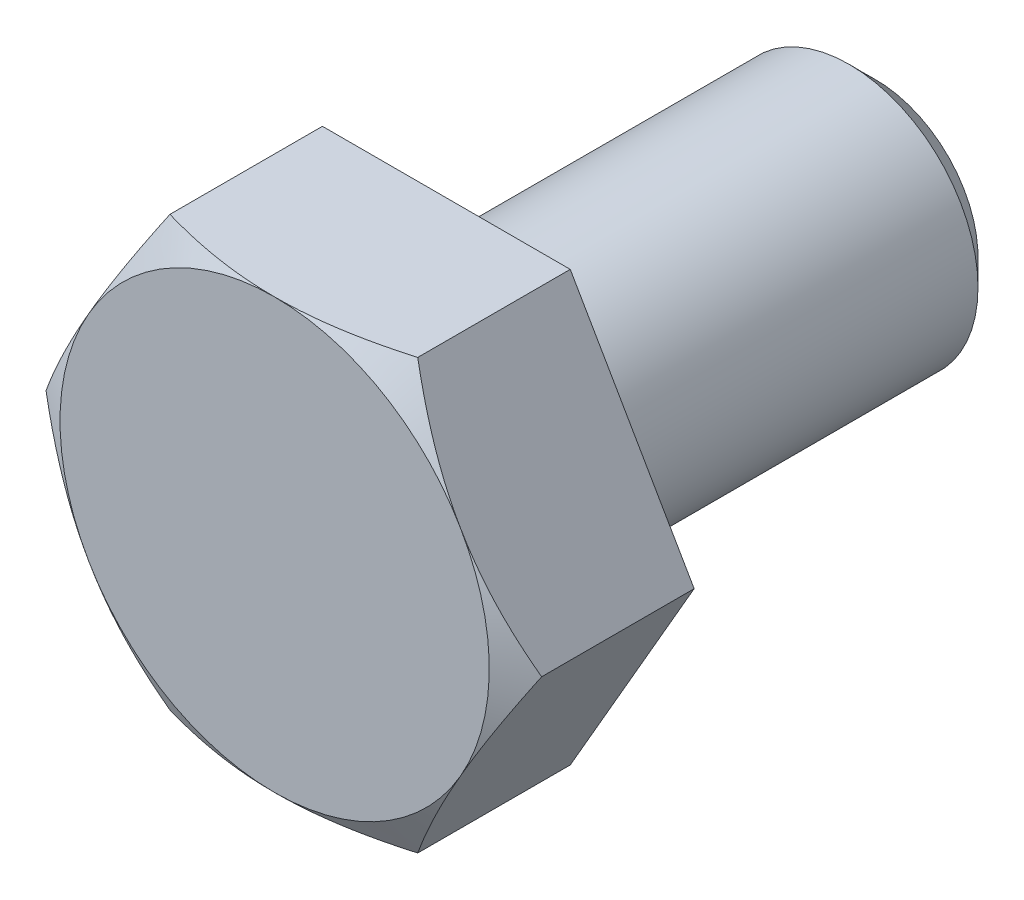
ISO-10303-21;
HEADER;
FILE_DESCRIPTION(('STEP AP214'),'2;1');
FILE_NAME('part.step','',(''),(''),'','','');
FILE_SCHEMA(('AUTOMOTIVE_DESIGN { 1 0 10303 214 1 1 1 1 }'));
ENDSEC;
DATA;
#1=APPLICATION_CONTEXT('core data for automotive mechanical design processes');
#2=APPLICATION_PROTOCOL_DEFINITION('international standard','automotive_design',2000,#1);
#3=PRODUCT_CONTEXT('',#1,'mechanical');
#4=PRODUCT('Part','Part','',(#3));
#5=PRODUCT_RELATED_PRODUCT_CATEGORY('part','',(#4));
#6=PRODUCT_DEFINITION_FORMATION('','',#4);
#7=PRODUCT_DEFINITION_CONTEXT('part definition',#1,'design');
#8=PRODUCT_DEFINITION('design','',#6,#7);
#9=PRODUCT_DEFINITION_SHAPE('','',#8);
#10=(LENGTH_UNIT() NAMED_UNIT(*) SI_UNIT(.MILLI.,.METRE.));
#11=(NAMED_UNIT(*) PLANE_ANGLE_UNIT() SI_UNIT($,.RADIAN.));
#12=(NAMED_UNIT(*) SI_UNIT($,.STERADIAN.) SOLID_ANGLE_UNIT());
#13=UNCERTAINTY_MEASURE_WITH_UNIT(LENGTH_MEASURE(1.E-05),#10,'distance_accuracy_value','');
#14=(GEOMETRIC_REPRESENTATION_CONTEXT(3) GLOBAL_UNCERTAINTY_ASSIGNED_CONTEXT((#13)) GLOBAL_UNIT_ASSIGNED_CONTEXT((#10,
#11,#12)) REPRESENTATION_CONTEXT('',''));
#15=CARTESIAN_POINT('',(0.,0.,0.));
#16=DIRECTION('',(0.,0.,1.));
#17=DIRECTION('',(1.,0.,0.));
#18=AXIS2_PLACEMENT_3D('',#15,#16,#17);
#19=CARTESIAN_POINT('',(-8.66025403784437,-5.,0.));
#20=DIRECTION('',(0.,0.,1.));
#21=DIRECTION('',(1.,0.,0.));
#22=AXIS2_PLACEMENT_3D('',#19,#20,#21);
#23=PLANE('',#22);
#24=CARTESIAN_POINT('',(0.,0.,0.));
#25=DIRECTION('',(0.,0.,1.));
#26=DIRECTION('',(1.,0.,0.));
#27=AXIS2_PLACEMENT_3D('',#24,#25,#26);
#28=CIRCLE('',#27,3.25);
#29=CARTESIAN_POINT('',(3.25,0.,0.));
#30=VERTEX_POINT('',#29);
#31=EDGE_CURVE('E11',#30,#30,#28,.T.);
#32=ORIENTED_EDGE('',*,*,#31,.T.);
#33=EDGE_LOOP('',(#32));
#34=FACE_BOUND('',#33,.T.);
#35=DIRECTION('',(-0.499999999999999,-0.866025403784439,0.));
#36=VECTOR('',#35,1.);
#37=CARTESIAN_POINT('',(-2.88675134594813,5.,0.));
#38=LINE('',#37,#36);
#39=CARTESIAN_POINT('',(-2.88675134594813,5.,0.));
#40=VERTEX_POINT('',#39);
#41=CARTESIAN_POINT('',(-5.77350269189626,0.,0.));
#42=VERTEX_POINT('',#41);
#43=EDGE_CURVE('E123',#40,#42,#38,.T.);
#44=ORIENTED_EDGE('',*,*,#43,.F.);
#45=DIRECTION('',(1.,0.,0.));
#46=VECTOR('',#45,1.);
#47=CARTESIAN_POINT('',(-2.88675134594813,5.,0.));
#48=LINE('',#47,#46);
#49=CARTESIAN_POINT('',(2.88675134594812,5.,0.));
#50=VERTEX_POINT('',#49);
#51=EDGE_CURVE('E255',#40,#50,#48,.T.);
#52=ORIENTED_EDGE('',*,*,#51,.T.);
#53=DIRECTION('',(0.5,-0.866025403784438,0.));
#54=VECTOR('',#53,1.);
#55=CARTESIAN_POINT('',(2.88675134594812,5.,0.));
#56=LINE('',#55,#54);
#57=CARTESIAN_POINT('',(5.77350269189626,0.,0.));
#58=VERTEX_POINT('',#57);
#59=EDGE_CURVE('E258',#50,#58,#56,.T.);
#60=ORIENTED_EDGE('',*,*,#59,.T.);
#61=DIRECTION('',(-0.5,-0.866025403784439,0.));
#62=VECTOR('',#61,1.);
#63=CARTESIAN_POINT('',(5.77350269189626,0.,0.));
#64=LINE('',#63,#62);
#65=CARTESIAN_POINT('',(2.88675134594813,-5.,0.));
#66=VERTEX_POINT('',#65);
#67=EDGE_CURVE('E261',#58,#66,#64,.T.);
#68=ORIENTED_EDGE('',*,*,#67,.T.);
#69=DIRECTION('',(1.,0.,0.));
#70=VECTOR('',#69,1.);
#71=CARTESIAN_POINT('',(-2.88675134594813,-5.,0.));
#72=LINE('',#71,#70);
#73=CARTESIAN_POINT('',(-2.88675134594813,-5.,0.));
#74=VERTEX_POINT('',#73);
#75=EDGE_CURVE('E246',#74,#66,#72,.T.);
#76=ORIENTED_EDGE('',*,*,#75,.F.);
#77=DIRECTION('',(0.5,-0.866025403784439,0.));
#78=VECTOR('',#77,1.);
#79=CARTESIAN_POINT('',(-5.77350269189626,0.,0.));
#80=LINE('',#79,#78);
#81=EDGE_CURVE('E264',#42,#74,#80,.T.);
#82=ORIENTED_EDGE('',*,*,#81,.F.);
#83=EDGE_LOOP('',(#44,#52,#60,#68,#76,#82));
#84=FACE_BOUND('',#83,.T.);
#85=ADVANCED_FACE('F31',(#34,#84),#23,.F.);
#86=CARTESIAN_POINT('',(-2.88675134594813,5.,4.));
#87=DIRECTION('',(0.866025403784439,-0.499999999999999,0.));
#88=DIRECTION('',(0.499999999999999,0.866025403784439,0.));
#89=AXIS2_PLACEMENT_3D('',#86,#87,#88);
#90=PLANE('',#89);
#91=DIRECTION('',(0.,0.,-1.));
#92=VECTOR('',#91,1.);
#93=CARTESIAN_POINT('',(-5.77350269189626,0.,4.));
#94=LINE('',#93,#92);
#95=CARTESIAN_POINT('',(-5.77350269189626,0.,3.5534180126148));
#96=VERTEX_POINT('',#95);
#97=EDGE_CURVE('E116',#96,#42,#94,.T.);
#98=ORIENTED_EDGE('',*,*,#97,.F.);
#99=CARTESIAN_POINT('',(-5.77361816195009,-0.000200000000005782,3.55335134394818));
#100=CARTESIAN_POINT('',(-5.6467543346507,0.219534594525179,3.62661343236237));
#101=CARTESIAN_POINT('',(-5.5188054379059,0.441148584459574,3.69324867808191));
#102=CARTESIAN_POINT('',(-5.26069210252318,0.888213995453507,3.80956100898919));
#103=CARTESIAN_POINT('',(-5.13052307794721,1.11367335959077,3.85919695008421));
#104=CARTESIAN_POINT('',(-4.87177839004641,1.5618323052235,3.9364489745813));
#105=CARTESIAN_POINT('',(-4.74324302208387,1.78446209310419,3.96457962171651));
#106=CARTESIAN_POINT('',(-4.54998783160117,2.11918990184663,3.98980507804631));
#107=CARTESIAN_POINT('',(-4.48552534905128,2.23084219680505,3.99538654023052));
#108=CARTESIAN_POINT('',(-4.35654081066911,2.45424997067379,4.00079778324853));
#109=CARTESIAN_POINT('',(-4.2920187567385,2.56600544629031,4.0006277417418));
#110=CARTESIAN_POINT('',(-4.11524635305245,2.87218423085063,3.99224636820796));
#111=CARTESIAN_POINT('',(-4.00305457769146,3.06650608596721,3.97817022810275));
#112=CARTESIAN_POINT('',(-3.77941563226458,3.4538601019977,3.93353474289057));
#113=CARTESIAN_POINT('',(-3.66796924828419,3.64689090137157,3.90296013985249));
#114=CARTESIAN_POINT('',(-3.44387972423144,4.03502534247485,3.82653150637884));
#115=CARTESIAN_POINT('',(-3.3312648659868,4.23007999864173,3.78035362112132));
#116=CARTESIAN_POINT('',(-3.10771464157941,4.61728034535877,3.67554820550807));
#117=CARTESIAN_POINT('',(-2.99677641204847,4.80943099540808,3.61694529656263));
#118=CARTESIAN_POINT('',(-2.88663587589429,5.0002,3.55335134394817));
#119=B_SPLINE_CURVE_WITH_KNOTS('',3,(#99,#100,#101,#102,#103,#104,#105,#106,#107,#108,#109,#110,
#111,#112,#113,#114,#115,#116,#117,#118),.UNSPECIFIED.,.F.,.F.,(4,2,2,2,2,2,2,2,2,4),(0.,
0.792555841363089,1.58701660053333,2.3618153748728,2.74884076077325,3.13585419177294,
3.80962362599679,4.48401723901189,5.17336882348928,5.86136694793725),.UNSPECIFIED.);
#120=CARTESIAN_POINT('',(-4.3301270189222,2.49999999999999,4.));
#121=VERTEX_POINT('',#120);
#122=EDGE_CURVE('E101',#96,#121,#119,.T.);
#123=ORIENTED_EDGE('',*,*,#122,.T.);
#124=CARTESIAN_POINT('',(-2.88675134594813,5.,3.5534180126148));
#125=VERTEX_POINT('',#124);
#126=EDGE_CURVE('E109',#121,#125,#119,.T.);
#127=ORIENTED_EDGE('',*,*,#126,.T.);
#128=DIRECTION('',(0.,0.,-1.));
#129=VECTOR('',#128,1.);
#130=CARTESIAN_POINT('',(-2.88675134594813,5.,4.));
#131=LINE('',#130,#129);
#132=EDGE_CURVE('E253',#125,#40,#131,.T.);
#133=ORIENTED_EDGE('',*,*,#132,.T.);
#134=ORIENTED_EDGE('',*,*,#43,.T.);
#135=EDGE_LOOP('',(#98,#123,#127,#133,#134));
#136=FACE_BOUND('',#135,.T.);
#137=ADVANCED_FACE('F121',(#136),#90,.F.);
#138=CARTESIAN_POINT('',(-5.77350269189626,0.,4.));
#139=DIRECTION('',(0.866025403784439,0.5,0.));
#140=DIRECTION('',(-0.5,0.866025403784439,0.));
#141=AXIS2_PLACEMENT_3D('',#138,#139,#140);
#142=PLANE('',#141);
#143=DIRECTION('',(0.,0.,-1.));
#144=VECTOR('',#143,1.);
#145=CARTESIAN_POINT('',(-2.88675134594813,-5.,4.));
#146=LINE('',#145,#144);
#147=CARTESIAN_POINT('',(-2.88675134594812,-5.,3.5534180126148));
#148=VERTEX_POINT('',#147);
#149=EDGE_CURVE('E125',#148,#74,#146,.T.);
#150=ORIENTED_EDGE('',*,*,#149,.F.);
#151=CARTESIAN_POINT('',(-2.88663587589429,-5.0002,3.55335134394817));
#152=CARTESIAN_POINT('',(-3.01349970319368,-4.78046540547482,3.62661343236237));
#153=CARTESIAN_POINT('',(-3.14144859993849,-4.55885141554042,3.69324867808191));
#154=CARTESIAN_POINT('',(-3.39956193532121,-4.11178600454649,3.80956100898919));
#155=CARTESIAN_POINT('',(-3.52973095989718,-3.88632664040923,3.85919695008421));
#156=CARTESIAN_POINT('',(-3.78847564779798,-3.43816769477649,3.9364489745813));
#157=CARTESIAN_POINT('',(-3.91701101576052,-3.21553790689581,3.96457962171651));
#158=CARTESIAN_POINT('',(-4.11026620624322,-2.88081009815336,3.98980507804631));
#159=CARTESIAN_POINT('',(-4.17472868879311,-2.76915780319494,3.99538654023051));
#160=CARTESIAN_POINT('',(-4.30371322717528,-2.54575002932621,4.00079778324853));
#161=CARTESIAN_POINT('',(-4.36823528110589,-2.43399455370969,4.00062774174179));
#162=CARTESIAN_POINT('',(-4.54500768479194,-2.12781576914936,3.99224636820796));
#163=CARTESIAN_POINT('',(-4.65719946015292,-1.93349391403279,3.97817022810275));
#164=CARTESIAN_POINT('',(-4.88083840557981,-1.5461398980023,3.93353474289057));
#165=CARTESIAN_POINT('',(-4.9922847895602,-1.35310909862843,3.90296013985249));
#166=CARTESIAN_POINT('',(-5.21637431361295,-0.96497465752515,3.82653150637884));
#167=CARTESIAN_POINT('',(-5.32898917185759,-0.769920001358269,3.78035362112132));
#168=CARTESIAN_POINT('',(-5.55253939626498,-0.382719654641237,3.67554820550807));
#169=CARTESIAN_POINT('',(-5.66347762579591,-0.190569004591919,3.61694529656263));
#170=CARTESIAN_POINT('',(-5.77361816195009,0.000199999999993787,3.55335134394818));
#171=B_SPLINE_CURVE_WITH_KNOTS('',3,(#151,#152,#153,#154,#155,#156,#157,#158,#159,#160,#161,
#162,#163,#164,#165,#166,#167,#168,#169,#170),.UNSPECIFIED.,.F.,.F.,(4,2,2,2,2,2,2,2,2,4),(0.,
0.79255584136309,1.58701660053333,2.3618153748728,2.74884076077325,3.13585419177295,
3.80962362599679,4.48401723901189,5.17336882348928,5.86136694793725),.UNSPECIFIED.);
#172=CARTESIAN_POINT('',(-4.33012701892219,-2.5,4.));
#173=VERTEX_POINT('',#172);
#174=EDGE_CURVE('E118',#148,#173,#171,.T.);
#175=ORIENTED_EDGE('',*,*,#174,.T.);
#176=EDGE_CURVE('E54',#173,#96,#171,.T.);
#177=ORIENTED_EDGE('',*,*,#176,.T.);
#178=ORIENTED_EDGE('',*,*,#97,.T.);
#179=ORIENTED_EDGE('',*,*,#81,.T.);
#180=EDGE_LOOP('',(#150,#175,#177,#178,#179));
#181=FACE_BOUND('',#180,.T.);
#182=ADVANCED_FACE('F114',(#181),#142,.F.);
#183=CARTESIAN_POINT('',(-2.88675134594813,-5.,4.));
#184=DIRECTION('',(0.,1.,0.));
#185=DIRECTION('',(0.,0.,1.));
#186=AXIS2_PLACEMENT_3D('',#183,#184,#185);
#187=PLANE('',#186);
#188=DIRECTION('',(0.,0.,-1.));
#189=VECTOR('',#188,1.);
#190=CARTESIAN_POINT('',(2.88675134594813,-5.,4.));
#191=LINE('',#190,#189);
#192=CARTESIAN_POINT('',(2.88675134594813,-5.,3.5534180126148));
#193=VERTEX_POINT('',#192);
#194=EDGE_CURVE('E131',#193,#66,#191,.T.);
#195=ORIENTED_EDGE('',*,*,#194,.F.);
#196=CARTESIAN_POINT('',(-7.65608998744865,-5.,1.60736647344924));
#197=CARTESIAN_POINT('',(-7.43656171400166,-5.,1.71345466182796));
#198=CARTESIAN_POINT('',(-7.21651440170021,-5.,1.81848824538408));
#199=CARTESIAN_POINT('',(-6.77510105921518,-5.,2.02584356636027));
#200=CARTESIAN_POINT('',(-6.55373480873052,-5.,2.12816483425435));
#201=CARTESIAN_POINT('',(-6.10820714710356,-5.,2.33003192146512));
#202=CARTESIAN_POINT('',(-5.88403698971124,-5.,2.42955850718272));
#203=CARTESIAN_POINT('',(-5.43385418074676,-5.,2.62433676721321));
#204=CARTESIAN_POINT('',(-5.20784162594277,-5.,2.71958866435759));
#205=CARTESIAN_POINT('',(-4.75080884782755,-5.,2.90581169081061));
#206=CARTESIAN_POINT('',(-4.51976121099505,-5.,2.99671590900132));
#207=CARTESIAN_POINT('',(-4.05494053422099,-5.,3.17140469702806));
#208=CARTESIAN_POINT('',(-3.82116719434024,-5.,3.25518847475236));
#209=CARTESIAN_POINT('',(-3.35100416711888,-5.,3.41338536763539));
#210=CARTESIAN_POINT('',(-3.11462125088187,-5.,3.48781840477474));
#211=CARTESIAN_POINT('',(-2.63849247870023,-5.,3.62489560612763));
#212=CARTESIAN_POINT('',(-2.3987477121033,-5.,3.68754349840305));
#213=CARTESIAN_POINT('',(-1.91574303714497,-5.,3.79801224600513));
#214=CARTESIAN_POINT('',(-1.672482210841,-5.,3.84582915344136));
#215=CARTESIAN_POINT('',(-1.18299359688664,-5.,3.9234044442076));
#216=CARTESIAN_POINT('',(-0.93676580661328,-5.,3.95316281157159));
#217=CARTESIAN_POINT('',(-0.567032279323847,-5.,3.9823487984137));
#218=CARTESIAN_POINT('',(-0.44410529765854,-5.,3.98950368094005));
#219=CARTESIAN_POINT('',(-0.198053005238565,-5.,3.99860454773096));
#220=CARTESIAN_POINT('',(-0.0749276970802291,-5.,4.00055059963961));
#221=CARTESIAN_POINT('',(0.171257999892353,-5.,3.99918152965433));
#222=CARTESIAN_POINT('',(0.294318397227088,-5.,3.99586788568699));
#223=CARTESIAN_POINT('',(0.54019273078884,-5.,3.98406340271724));
#224=CARTESIAN_POINT('',(0.663006654263483,-5.,3.97557230242983));
#225=CARTESIAN_POINT('',(0.96068187288167,-5.,3.9488936197247));
#226=CARTESIAN_POINT('',(1.1353143627994,-5.,3.92811103230171));
#227=CARTESIAN_POINT('',(1.4832167579939,-5.,3.8772343442773));
#228=CARTESIAN_POINT('',(1.65648647841238,-5.,3.84713900200996));
#229=CARTESIAN_POINT('',(2.00155426058702,-5.,3.77870120798844));
#230=CARTESIAN_POINT('',(2.17335067370376,-5.,3.74035052251359));
#231=CARTESIAN_POINT('',(2.51518168221058,-5.,3.65657169461498));
#232=CARTESIAN_POINT('',(2.68521638419315,-5.,3.61114398308599));
#233=CARTESIAN_POINT('',(3.02770318928897,-5.,3.5131122179457));
#234=CARTESIAN_POINT('',(3.20011248435317,-5.,3.46035963617605));
#235=CARTESIAN_POINT('',(3.54310870430183,-5.,3.34964221269736));
#236=CARTESIAN_POINT('',(3.71369679659721,-5.,3.29168096609292));
#237=CARTESIAN_POINT('',(4.0523661026798,-5.,3.17174345927151));
#238=CARTESIAN_POINT('',(4.22045602230063,-5.,3.10979163457362));
#239=CARTESIAN_POINT('',(4.55533171687456,-5.,2.98225176586186));
#240=CARTESIAN_POINT('',(4.72211693321423,-5.,2.91666225221221));
#241=CARTESIAN_POINT('',(4.88829623733364,-5.,2.84961374182274));
#242=B_SPLINE_CURVE_WITH_KNOTS('',3,(#196,#197,#198,#199,#200,#201,#202,#203,#204,#205,#206,
#207,#208,#209,#210,#211,#212,#213,#214,#215,#216,#217,#218,#219,#220,#221,#222,#223,#224,#225,
#226,#227,#228,#229,#230,#231,#232,#233,#234,#235,#236,#237,#238,#239,#240,#241),.UNSPECIFIED.,
.F.,.F.,(4,2,2,2,2,2,2,2,2,2,2,2,2,2,2,2,2,2,2,2,2,2,4),(0.,0.73146474066535,1.46305528824908,
2.19883243307486,2.93457117856033,3.67934251246857,4.42419659013361,5.16743580871988,
5.91043951739337,6.65364083834805,7.39684281638514,7.76615414335455,8.13546067426609,
8.50466345177854,8.87388486298451,9.40118542949727,9.92855633110016,10.4564556797854,
10.9843228991235,11.5251202808281,12.0655472210641,12.6029322754131,13.1405360390026),.UNSPECIFIED.);
#243=CARTESIAN_POINT('',(0.,-5.,4.));
#244=VERTEX_POINT('',#243);
#245=EDGE_CURVE('E208',#193,#244,#242,.F.);
#246=ORIENTED_EDGE('',*,*,#245,.T.);
#247=EDGE_CURVE('E46',#244,#148,#242,.F.);
#248=ORIENTED_EDGE('',*,*,#247,.T.);
#249=ORIENTED_EDGE('',*,*,#149,.T.);
#250=ORIENTED_EDGE('',*,*,#75,.T.);
#251=EDGE_LOOP('',(#195,#246,#248,#249,#250));
#252=FACE_BOUND('',#251,.T.);
#253=ADVANCED_FACE('F224',(#252),#187,.F.);
#254=CARTESIAN_POINT('',(5.77350269189626,0.,4.));
#255=DIRECTION('',(0.866025403784439,-0.5,0.));
#256=DIRECTION('',(0.5,0.866025403784439,0.));
#257=AXIS2_PLACEMENT_3D('',#254,#255,#256);
#258=PLANE('',#257);
#259=CARTESIAN_POINT('',(2.88663587589429,-5.0002,3.55335134394817));
#260=CARTESIAN_POINT('',(3.01349970319368,-4.78046540547482,3.62661343236237));
#261=CARTESIAN_POINT('',(3.14144859993849,-4.55885141554042,3.69324867808191));
#262=CARTESIAN_POINT('',(3.39956193532121,-4.11178600454649,3.80956100898919));
#263=CARTESIAN_POINT('',(3.52973095989718,-3.88632664040923,3.85919695008421));
#264=CARTESIAN_POINT('',(3.78847564779797,-3.43816769477649,3.9364489745813));
#265=CARTESIAN_POINT('',(3.91701101576052,-3.21553790689581,3.96457962171651));
#266=CARTESIAN_POINT('',(4.11026620624322,-2.88081009815336,3.98980507804632));
#267=CARTESIAN_POINT('',(4.1747286887931,-2.76915780319494,3.99538654023052));
#268=CARTESIAN_POINT('',(4.30371322717527,-2.54575002932621,4.00079778324853));
#269=CARTESIAN_POINT('',(4.36823528110588,-2.43399455370969,4.0006277417418));
#270=CARTESIAN_POINT('',(4.54500768479194,-2.12781576914936,3.99224636820796));
#271=CARTESIAN_POINT('',(4.65719946015292,-1.93349391403279,3.97817022810275));
#272=CARTESIAN_POINT('',(4.88083840557981,-1.5461398980023,3.93353474289057));
#273=CARTESIAN_POINT('',(4.9922847895602,-1.35310909862843,3.90296013985249));
#274=CARTESIAN_POINT('',(5.21637431361295,-0.964974657525147,3.82653150637884));
#275=CARTESIAN_POINT('',(5.32898917185758,-0.769920001358266,3.78035362112132));
#276=CARTESIAN_POINT('',(5.55253939626498,-0.382719654641233,3.67554820550807));
#277=CARTESIAN_POINT('',(5.66347762579591,-0.190569004591914,3.61694529656263));
#278=CARTESIAN_POINT('',(5.77361816195009,0.000199999999999473,3.55335134394818));
#279=B_SPLINE_CURVE_WITH_KNOTS('',3,(#259,#260,#261,#262,#263,#264,#265,#266,#267,#268,#269,
#270,#271,#272,#273,#274,#275,#276,#277,#278),.UNSPECIFIED.,.F.,.F.,(4,2,2,2,2,2,2,2,2,4),(0.,
0.792555841363091,1.58701660053333,2.3618153748728,2.74884076077325,3.13585419177295,
3.80962362599679,4.48401723901189,5.17336882348928,5.86136694793725),.UNSPECIFIED.);
#280=CARTESIAN_POINT('',(4.33012701892219,-2.5,4.));
#281=VERTEX_POINT('',#280);
#282=EDGE_CURVE('E238',#193,#281,#279,.T.);
#283=ORIENTED_EDGE('',*,*,#282,.F.);
#284=ORIENTED_EDGE('',*,*,#194,.T.);
#285=ORIENTED_EDGE('',*,*,#67,.F.);
#286=DIRECTION('',(0.,0.,-1.));
#287=VECTOR('',#286,1.);
#288=CARTESIAN_POINT('',(5.77350269189626,0.,4.));
#289=LINE('',#288,#287);
#290=CARTESIAN_POINT('',(5.77350269189626,0.,3.5534180126148));
#291=VERTEX_POINT('',#290);
#292=EDGE_CURVE('E248',#291,#58,#289,.T.);
#293=ORIENTED_EDGE('',*,*,#292,.F.);
#294=EDGE_CURVE('E203',#281,#291,#279,.T.);
#295=ORIENTED_EDGE('',*,*,#294,.F.);
#296=EDGE_LOOP('',(#283,#284,#285,#293,#295));
#297=FACE_BOUND('',#296,.T.);
#298=ADVANCED_FACE('F227',(#297),#258,.T.);
#299=CARTESIAN_POINT('',(2.88675134594812,5.,4.));
#300=DIRECTION('',(0.866025403784438,0.5,0.));
#301=DIRECTION('',(-0.5,0.866025403784438,0.));
#302=AXIS2_PLACEMENT_3D('',#299,#300,#301);
#303=PLANE('',#302);
#304=CARTESIAN_POINT('',(5.77361816195009,-0.000200000000000131,3.55335134394818));
#305=CARTESIAN_POINT('',(5.6467543346507,0.219534594525185,3.62661343236237));
#306=CARTESIAN_POINT('',(5.51880543790589,0.44114858445958,3.69324867808191));
#307=CARTESIAN_POINT('',(5.26069210252318,0.888213995453511,3.80956100898919));
#308=CARTESIAN_POINT('',(5.13052307794721,1.11367335959077,3.85919695008421));
#309=CARTESIAN_POINT('',(4.87177839004641,1.56183230522351,3.9364489745813));
#310=CARTESIAN_POINT('',(4.74324302208387,1.78446209310419,3.96457962171651));
#311=CARTESIAN_POINT('',(4.54998783160116,2.11918990184664,3.98980507804632));
#312=CARTESIAN_POINT('',(4.48552534905128,2.23084219680506,3.99538654023052));
#313=CARTESIAN_POINT('',(4.35654081066911,2.45424997067379,4.00079778324853));
#314=CARTESIAN_POINT('',(4.2920187567385,2.56600544629031,4.0006277417418));
#315=CARTESIAN_POINT('',(4.11524635305244,2.87218423085063,3.99224636820796));
#316=CARTESIAN_POINT('',(4.00305457769146,3.06650608596721,3.97817022810275));
#317=CARTESIAN_POINT('',(3.77941563226457,3.4538601019977,3.93353474289057));
#318=CARTESIAN_POINT('',(3.66796924828418,3.64689090137157,3.90296013985249));
#319=CARTESIAN_POINT('',(3.44387972423144,4.03502534247485,3.82653150637884));
#320=CARTESIAN_POINT('',(3.3312648659868,4.23007999864173,3.78035362112132));
#321=CARTESIAN_POINT('',(3.1077146415794,4.61728034535877,3.67554820550807));
#322=CARTESIAN_POINT('',(2.99677641204847,4.80943099540808,3.61694529656263));
#323=CARTESIAN_POINT('',(2.88663587589429,5.0002,3.55335134394818));
#324=B_SPLINE_CURVE_WITH_KNOTS('',3,(#304,#305,#306,#307,#308,#309,#310,#311,#312,#313,#314,
#315,#316,#317,#318,#319,#320,#321,#322,#323),.UNSPECIFIED.,.F.,.F.,(4,2,2,2,2,2,2,2,2,4),(0.,
0.792555841363089,1.58701660053333,2.3618153748728,2.74884076077325,3.13585419177294,
3.80962362599679,4.48401723901189,5.17336882348928,5.86136694793725),.UNSPECIFIED.);
#325=CARTESIAN_POINT('',(4.33012701892219,2.5,4.));
#326=VERTEX_POINT('',#325);
#327=EDGE_CURVE('E270',#291,#326,#324,.T.);
#328=ORIENTED_EDGE('',*,*,#327,.F.);
#329=ORIENTED_EDGE('',*,*,#292,.T.);
#330=ORIENTED_EDGE('',*,*,#59,.F.);
#331=DIRECTION('',(0.,0.,-1.));
#332=VECTOR('',#331,1.);
#333=CARTESIAN_POINT('',(2.88675134594812,5.,4.));
#334=LINE('',#333,#332);
#335=CARTESIAN_POINT('',(2.88675134594813,5.,3.5534180126148));
#336=VERTEX_POINT('',#335);
#337=EDGE_CURVE('E249',#336,#50,#334,.T.);
#338=ORIENTED_EDGE('',*,*,#337,.F.);
#339=EDGE_CURVE('E185',#326,#336,#324,.T.);
#340=ORIENTED_EDGE('',*,*,#339,.F.);
#341=EDGE_LOOP('',(#328,#329,#330,#338,#340));
#342=FACE_BOUND('',#341,.T.);
#343=ADVANCED_FACE('F172',(#342),#303,.T.);
#344=CARTESIAN_POINT('',(-2.88675134594813,5.,4.));
#345=DIRECTION('',(0.,1.,0.));
#346=DIRECTION('',(0.,0.,1.));
#347=AXIS2_PLACEMENT_3D('',#344,#345,#346);
#348=PLANE('',#347);
#349=CARTESIAN_POINT('',(-7.65608998744865,5.,1.60736647344924));
#350=CARTESIAN_POINT('',(-7.43656171400166,5.,1.71345466182797));
#351=CARTESIAN_POINT('',(-7.21651440170021,5.,1.81848824538408));
#352=CARTESIAN_POINT('',(-6.77510105921518,5.,2.02584356636027));
#353=CARTESIAN_POINT('',(-6.55373480873052,5.,2.12816483425435));
#354=CARTESIAN_POINT('',(-6.10820714710357,5.,2.33003192146512));
#355=CARTESIAN_POINT('',(-5.88403698971124,5.,2.42955850718272));
#356=CARTESIAN_POINT('',(-5.43385418074677,5.,2.62433676721321));
#357=CARTESIAN_POINT('',(-5.20784162594278,5.,2.71958866435759));
#358=CARTESIAN_POINT('',(-4.75080884782756,5.,2.9058116908106));
#359=CARTESIAN_POINT('',(-4.51976121099505,5.,2.99671590900132));
#360=CARTESIAN_POINT('',(-4.05494053422099,5.,3.17140469702806));
#361=CARTESIAN_POINT('',(-3.82116719434024,5.,3.25518847475236));
#362=CARTESIAN_POINT('',(-3.35100416711889,5.,3.41338536763539));
#363=CARTESIAN_POINT('',(-3.11462125088188,5.,3.48781840477474));
#364=CARTESIAN_POINT('',(-2.63849247870023,5.,3.62489560612763));
#365=CARTESIAN_POINT('',(-2.3987477121033,5.,3.68754349840306));
#366=CARTESIAN_POINT('',(-1.91574303714497,5.,3.79801224600513));
#367=CARTESIAN_POINT('',(-1.672482210841,5.,3.84582915344136));
#368=CARTESIAN_POINT('',(-1.18299359688664,5.,3.9234044442076));
#369=CARTESIAN_POINT('',(-0.936765806613282,5.,3.95316281157159));
#370=CARTESIAN_POINT('',(-0.56703227932385,5.,3.9823487984137));
#371=CARTESIAN_POINT('',(-0.444105297658542,5.,3.98950368094005));
#372=CARTESIAN_POINT('',(-0.198053005238569,5.,3.99860454773096));
#373=CARTESIAN_POINT('',(-0.0749276970802328,5.,4.00055059963961));
#374=CARTESIAN_POINT('',(0.171257999892348,5.,3.99918152965434));
#375=CARTESIAN_POINT('',(0.294318397227083,5.,3.99586788568699));
#376=CARTESIAN_POINT('',(0.540192730788835,5.,3.98406340271724));
#377=CARTESIAN_POINT('',(0.663006654263477,5.,3.97557230242984));
#378=CARTESIAN_POINT('',(0.960681872881664,5.,3.9488936197247));
#379=CARTESIAN_POINT('',(1.1353143627994,5.,3.92811103230171));
#380=CARTESIAN_POINT('',(1.4832167579939,5.,3.87723434427731));
#381=CARTESIAN_POINT('',(1.65648647841237,5.,3.84713900200997));
#382=CARTESIAN_POINT('',(2.00155426058701,5.,3.77870120798845));
#383=CARTESIAN_POINT('',(2.17335067370375,5.,3.74035052251359));
#384=CARTESIAN_POINT('',(2.51518168221057,5.,3.65657169461499));
#385=CARTESIAN_POINT('',(2.68521638419313,5.,3.611143983086));
#386=CARTESIAN_POINT('',(3.02770318928895,5.,3.5131122179457));
#387=CARTESIAN_POINT('',(3.20011248435316,5.,3.46035963617605));
#388=CARTESIAN_POINT('',(3.54310870430181,5.,3.34964221269737));
#389=CARTESIAN_POINT('',(3.71369679659719,5.,3.29168096609292));
#390=CARTESIAN_POINT('',(4.05236610267979,5.,3.17174345927152));
#391=CARTESIAN_POINT('',(4.22045602230062,5.,3.10979163457363));
#392=CARTESIAN_POINT('',(4.55533171687455,5.,2.98225176586187));
#393=CARTESIAN_POINT('',(4.72211693321421,5.,2.91666225221222));
#394=CARTESIAN_POINT('',(4.88829623733363,5.,2.84961374182275));
#395=B_SPLINE_CURVE_WITH_KNOTS('',3,(#349,#350,#351,#352,#353,#354,#355,#356,#357,#358,#359,
#360,#361,#362,#363,#364,#365,#366,#367,#368,#369,#370,#371,#372,#373,#374,#375,#376,#377,#378,
#379,#380,#381,#382,#383,#384,#385,#386,#387,#388,#389,#390,#391,#392,#393,#394),.UNSPECIFIED.,
.F.,.F.,(4,2,2,2,2,2,2,2,2,2,2,2,2,2,2,2,2,2,2,2,2,2,4),(0.,0.73146474066535,1.46305528824908,
2.19883243307485,2.93457117856033,3.67934251246857,4.4241965901336,5.16743580871988,
5.91043951739337,6.65364083834805,7.39684281638514,7.76615414335454,8.13546067426608,
8.50466345177854,8.8738848629845,9.40118542949726,9.92855633110014,10.4564556797854,
10.9843228991235,11.525120280828,12.065547221064,12.6029322754131,13.1405360390026),.UNSPECIFIED.);
#396=CARTESIAN_POINT('',(0.,5.,4.));
#397=VERTEX_POINT('',#396);
#398=EDGE_CURVE('E183',#336,#397,#395,.F.);
#399=ORIENTED_EDGE('',*,*,#398,.F.);
#400=ORIENTED_EDGE('',*,*,#337,.T.);
#401=ORIENTED_EDGE('',*,*,#51,.F.);
#402=ORIENTED_EDGE('',*,*,#132,.F.);
#403=EDGE_CURVE('E177',#397,#125,#395,.F.);
#404=ORIENTED_EDGE('',*,*,#403,.F.);
#405=EDGE_LOOP('',(#399,#400,#401,#402,#404));
#406=FACE_BOUND('',#405,.T.);
#407=ADVANCED_FACE('F167',(#406),#348,.T.);
#408=CARTESIAN_POINT('',(0.,0.,4.));
#409=DIRECTION('',(0.,0.,-1.));
#410=DIRECTION('',(-1.,0.,0.));
#411=AXIS2_PLACEMENT_3D('',#408,#409,#410);
#412=CONICAL_SURFACE('',#411,5.,1.0471975511966);
#413=ORIENTED_EDGE('',*,*,#294,.T.);
#414=ORIENTED_EDGE('',*,*,#327,.T.);
#415=CARTESIAN_POINT('',(0.,0.,4.));
#416=DIRECTION('',(0.,0.,1.));
#417=DIRECTION('',(1.,0.,0.));
#418=AXIS2_PLACEMENT_3D('',#415,#416,#417);
#419=CIRCLE('',#418,5.);
#420=EDGE_CURVE('E124',#326,#281,#419,.F.);
#421=ORIENTED_EDGE('',*,*,#420,.T.);
#422=EDGE_LOOP('',(#413,#414,#421));
#423=FACE_BOUND('',#422,.T.);
#424=ADVANCED_FACE('F171',(#423),#412,.T.);
#425=ORIENTED_EDGE('',*,*,#339,.T.);
#426=ORIENTED_EDGE('',*,*,#398,.T.);
#427=EDGE_CURVE('E128',#397,#326,#419,.F.);
#428=ORIENTED_EDGE('',*,*,#427,.T.);
#429=EDGE_LOOP('',(#425,#426,#428));
#430=FACE_BOUND('',#429,.T.);
#431=ADVANCED_FACE('F190',(#430),#412,.T.);
#432=CARTESIAN_POINT('',(0.,0.,4.));
#433=DIRECTION('',(0.,0.,-1.));
#434=DIRECTION('',(-1.,0.,0.));
#435=AXIS2_PLACEMENT_3D('',#432,#433,#434);
#436=CIRCLE('',#435,5.);
#437=EDGE_CURVE('E184',#121,#397,#436,.T.);
#438=ORIENTED_EDGE('',*,*,#437,.T.);
#439=ORIENTED_EDGE('',*,*,#403,.T.);
#440=ORIENTED_EDGE('',*,*,#126,.F.);
#441=EDGE_LOOP('',(#438,#439,#440));
#442=FACE_BOUND('',#441,.T.);
#443=ADVANCED_FACE('F194',(#442),#412,.T.);
#444=EDGE_CURVE('E104',#173,#121,#419,.F.);
#445=ORIENTED_EDGE('',*,*,#444,.T.);
#446=ORIENTED_EDGE('',*,*,#122,.F.);
#447=ORIENTED_EDGE('',*,*,#176,.F.);
#448=EDGE_LOOP('',(#445,#446,#447));
#449=FACE_BOUND('',#448,.T.);
#450=ADVANCED_FACE('F102',(#449),#412,.T.);
#451=ORIENTED_EDGE('',*,*,#247,.F.);
#452=EDGE_CURVE('E283',#244,#173,#419,.F.);
#453=ORIENTED_EDGE('',*,*,#452,.T.);
#454=ORIENTED_EDGE('',*,*,#174,.F.);
#455=EDGE_LOOP('',(#451,#453,#454));
#456=FACE_BOUND('',#455,.T.);
#457=ADVANCED_FACE('F196',(#456),#412,.T.);
#458=ORIENTED_EDGE('',*,*,#282,.T.);
#459=EDGE_CURVE('E130',#281,#244,#419,.F.);
#460=ORIENTED_EDGE('',*,*,#459,.T.);
#461=ORIENTED_EDGE('',*,*,#245,.F.);
#462=EDGE_LOOP('',(#458,#460,#461));
#463=FACE_BOUND('',#462,.T.);
#464=ADVANCED_FACE('F284',(#463),#412,.T.);
#465=CARTESIAN_POINT('',(-8.66025403784437,-5.,4.));
#466=DIRECTION('',(0.,0.,1.));
#467=DIRECTION('',(1.,0.,0.));
#468=AXIS2_PLACEMENT_3D('',#465,#466,#467);
#469=PLANE('',#468);
#470=ORIENTED_EDGE('',*,*,#459,.F.);
#471=ORIENTED_EDGE('',*,*,#420,.F.);
#472=ORIENTED_EDGE('',*,*,#427,.F.);
#473=ORIENTED_EDGE('',*,*,#437,.F.);
#474=ORIENTED_EDGE('',*,*,#444,.F.);
#475=ORIENTED_EDGE('',*,*,#452,.F.);
#476=EDGE_LOOP('',(#470,#471,#472,#473,#474,#475));
#477=FACE_BOUND('',#476,.T.);
#478=ADVANCED_FACE('F165',(#477),#469,.T.);
#479=CARTESIAN_POINT('',(0.,0.,-10.));
#480=DIRECTION('',(0.,0.,1.));
#481=DIRECTION('',(1.,0.,0.));
#482=AXIS2_PLACEMENT_3D('',#479,#480,#481);
#483=CYLINDRICAL_SURFACE('',#482,3.);
#484=CARTESIAN_POINT('',(0.,0.,-0.25));
#485=DIRECTION('',(0.,0.,1.));
#486=DIRECTION('',(1.,0.,0.));
#487=AXIS2_PLACEMENT_3D('',#484,#485,#486);
#488=CIRCLE('',#487,3.);
#489=CARTESIAN_POINT('',(3.,0.,-0.25));
#490=VERTEX_POINT('',#489);
#491=EDGE_CURVE('E39',#490,#490,#488,.F.);
#492=ORIENTED_EDGE('',*,*,#491,.T.);
#493=EDGE_LOOP('',(#492));
#494=FACE_BOUND('',#493,.T.);
#495=CARTESIAN_POINT('',(0.,0.,-9.3866));
#496=DIRECTION('',(0.,0.,-1.));
#497=DIRECTION('',(-1.,0.,0.));
#498=AXIS2_PLACEMENT_3D('',#495,#496,#497);
#499=CIRCLE('',#498,3.);
#500=CARTESIAN_POINT('',(-3.,0.,-9.3866));
#501=VERTEX_POINT('',#500);
#502=EDGE_CURVE('E138',#501,#501,#499,.F.);
#503=ORIENTED_EDGE('',*,*,#502,.T.);
#504=EDGE_LOOP('',(#503));
#505=FACE_BOUND('',#504,.T.);
#506=ADVANCED_FACE('F143',(#494,#505),#483,.T.);
#507=CARTESIAN_POINT('',(0.,0.,-10.));
#508=DIRECTION('',(0.,0.,-1.));
#509=DIRECTION('',(-1.,0.,0.));
#510=AXIS2_PLACEMENT_3D('',#507,#508,#509);
#511=PLANE('',#510);
#512=CARTESIAN_POINT('',(0.,0.,-10.));
#513=DIRECTION('',(0.,0.,-1.));
#514=DIRECTION('',(-1.,0.,0.));
#515=AXIS2_PLACEMENT_3D('',#512,#513,#514);
#516=CIRCLE('',#515,2.38659999999999);
#517=CARTESIAN_POINT('',(-2.38659999999999,0.,-10.));
#518=VERTEX_POINT('',#517);
#519=EDGE_CURVE('E135',#518,#518,#516,.T.);
#520=ORIENTED_EDGE('',*,*,#519,.T.);
#521=EDGE_LOOP('',(#520));
#522=FACE_BOUND('',#521,.T.);
#523=ADVANCED_FACE('F152',(#522),#511,.T.);
#524=CARTESIAN_POINT('',(0.,0.,-10.));
#525=DIRECTION('',(0.,0.,1.));
#526=DIRECTION('',(1.,0.,0.));
#527=AXIS2_PLACEMENT_3D('',#524,#525,#526);
#528=CONICAL_SURFACE('',#527,2.38659999999999,0.785398163397454);
#529=ORIENTED_EDGE('',*,*,#502,.F.);
#530=EDGE_LOOP('',(#529));
#531=FACE_BOUND('',#530,.T.);
#532=ORIENTED_EDGE('',*,*,#519,.F.);
#533=EDGE_LOOP('',(#532));
#534=FACE_BOUND('',#533,.T.);
#535=ADVANCED_FACE('F147',(#531,#534),#528,.T.);
#536=CARTESIAN_POINT('',(0.,0.,-0.25));
#537=DIRECTION('',(0.,0.,1.));
#538=DIRECTION('',(1.,0.,0.));
#539=AXIS2_PLACEMENT_3D('',#536,#537,#538);
#540=TOROIDAL_SURFACE('',#539,3.25,0.25);
#541=ORIENTED_EDGE('',*,*,#31,.F.);
#542=EDGE_LOOP('',(#541));
#543=FACE_BOUND('',#542,.T.);
#544=ORIENTED_EDGE('',*,*,#491,.F.);
#545=EDGE_LOOP('',(#544));
#546=FACE_BOUND('',#545,.T.);
#547=ADVANCED_FACE('F33',(#543,#546),#540,.F.);
#548=CLOSED_SHELL('',(#85,#137,#182,#253,#298,#343,#407,#424,#431,#443,#450,#457,#464,#478,#506,
#523,#535,#547));
#549=MANIFOLD_SOLID_BREP('B2',#548);
#550=ADVANCED_BREP_SHAPE_REPRESENTATION('',(#18,#549),#14);
#551=SHAPE_DEFINITION_REPRESENTATION(#9,#550);
ENDSEC;
END-ISO-10303-21;
